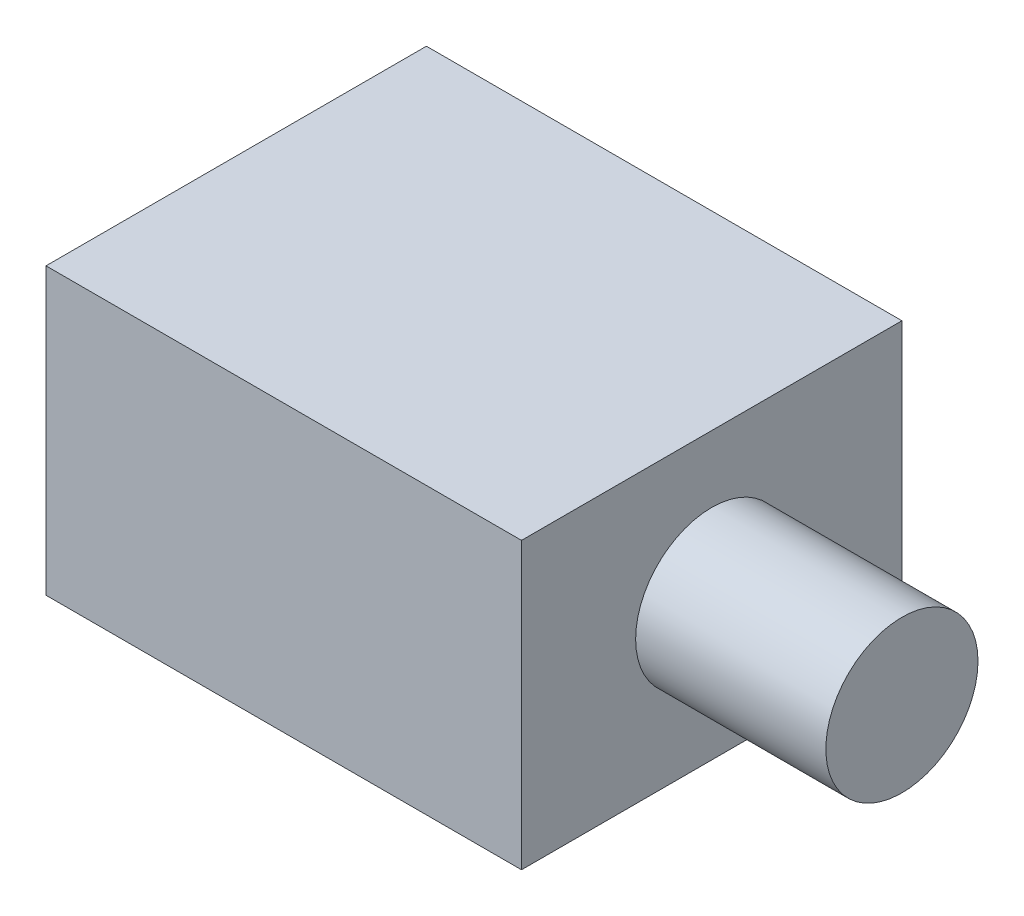
ISO-10303-21;
HEADER;
FILE_DESCRIPTION(('STEP AP214'),'2;1');
FILE_NAME('part.step','',(''),(''),'','','');
FILE_SCHEMA(('AUTOMOTIVE_DESIGN { 1 0 10303 214 1 1 1 1 }'));
ENDSEC;
DATA;
#1=APPLICATION_CONTEXT('core data for automotive mechanical design processes');
#2=APPLICATION_PROTOCOL_DEFINITION('international standard','automotive_design',2000,#1);
#3=PRODUCT_CONTEXT('',#1,'mechanical');
#4=PRODUCT('Part','Part','',(#3));
#5=PRODUCT_RELATED_PRODUCT_CATEGORY('part','',(#4));
#6=PRODUCT_DEFINITION_FORMATION('','',#4);
#7=PRODUCT_DEFINITION_CONTEXT('part definition',#1,'design');
#8=PRODUCT_DEFINITION('design','',#6,#7);
#9=PRODUCT_DEFINITION_SHAPE('','',#8);
#10=(LENGTH_UNIT() NAMED_UNIT(*) SI_UNIT(.MILLI.,.METRE.));
#11=(NAMED_UNIT(*) PLANE_ANGLE_UNIT() SI_UNIT($,.RADIAN.));
#12=(NAMED_UNIT(*) SI_UNIT($,.STERADIAN.) SOLID_ANGLE_UNIT());
#13=UNCERTAINTY_MEASURE_WITH_UNIT(LENGTH_MEASURE(1.E-05),#10,'distance_accuracy_value','');
#14=(GEOMETRIC_REPRESENTATION_CONTEXT(3) GLOBAL_UNCERTAINTY_ASSIGNED_CONTEXT((#13)) GLOBAL_UNIT_ASSIGNED_CONTEXT((#10,
#11,#12)) REPRESENTATION_CONTEXT('',''));
#15=CARTESIAN_POINT('',(0.,0.,0.));
#16=DIRECTION('',(0.,0.,1.));
#17=DIRECTION('',(1.,0.,0.));
#18=AXIS2_PLACEMENT_3D('',#15,#16,#17);
#19=CARTESIAN_POINT('',(-25.,30.,20.));
#20=DIRECTION('',(1.,0.,0.));
#21=DIRECTION('',(0.,0.,-1.));
#22=AXIS2_PLACEMENT_3D('',#19,#20,#21);
#23=PLANE('',#22);
#24=DIRECTION('',(0.,0.,1.));
#25=VECTOR('',#24,1.);
#26=CARTESIAN_POINT('',(-25.,0.,20.));
#27=LINE('',#26,#25);
#28=CARTESIAN_POINT('',(-25.,0.,-20.));
#29=VERTEX_POINT('',#28);
#30=CARTESIAN_POINT('',(-25.,0.,20.));
#31=VERTEX_POINT('',#30);
#32=EDGE_CURVE('E123',#29,#31,#27,.T.);
#33=ORIENTED_EDGE('',*,*,#32,.T.);
#34=DIRECTION('',(0.,-1.,0.));
#35=VECTOR('',#34,1.);
#36=CARTESIAN_POINT('',(-25.,30.,20.));
#37=LINE('',#36,#35);
#38=CARTESIAN_POINT('',(-25.,30.,20.));
#39=VERTEX_POINT('',#38);
#40=EDGE_CURVE('E55',#39,#31,#37,.T.);
#41=ORIENTED_EDGE('',*,*,#40,.F.);
#42=DIRECTION('',(0.,0.,1.));
#43=VECTOR('',#42,1.);
#44=CARTESIAN_POINT('',(-25.,30.,20.));
#45=LINE('',#44,#43);
#46=CARTESIAN_POINT('',(-25.,30.,-20.));
#47=VERTEX_POINT('',#46);
#48=EDGE_CURVE('E106',#47,#39,#45,.T.);
#49=ORIENTED_EDGE('',*,*,#48,.F.);
#50=DIRECTION('',(0.,-1.,0.));
#51=VECTOR('',#50,1.);
#52=CARTESIAN_POINT('',(-25.,30.,-20.));
#53=LINE('',#52,#51);
#54=EDGE_CURVE('E119',#47,#29,#53,.T.);
#55=ORIENTED_EDGE('',*,*,#54,.T.);
#56=EDGE_LOOP('',(#33,#41,#49,#55));
#57=FACE_BOUND('',#56,.T.);
#58=ADVANCED_FACE('F51',(#57),#23,.F.);
#59=CARTESIAN_POINT('',(25.,30.,20.));
#60=DIRECTION('',(0.,0.,-1.));
#61=DIRECTION('',(-1.,0.,0.));
#62=AXIS2_PLACEMENT_3D('',#59,#60,#61);
#63=PLANE('',#62);
#64=DIRECTION('',(1.,0.,0.));
#65=VECTOR('',#64,1.);
#66=CARTESIAN_POINT('',(25.,0.,20.));
#67=LINE('',#66,#65);
#68=CARTESIAN_POINT('',(25.,0.,20.));
#69=VERTEX_POINT('',#68);
#70=EDGE_CURVE('E112',#31,#69,#67,.T.);
#71=ORIENTED_EDGE('',*,*,#70,.T.);
#72=DIRECTION('',(0.,-1.,0.));
#73=VECTOR('',#72,1.);
#74=CARTESIAN_POINT('',(25.,30.,20.));
#75=LINE('',#74,#73);
#76=CARTESIAN_POINT('',(25.,30.,20.));
#77=VERTEX_POINT('',#76);
#78=EDGE_CURVE('E110',#77,#69,#75,.T.);
#79=ORIENTED_EDGE('',*,*,#78,.F.);
#80=DIRECTION('',(1.,0.,0.));
#81=VECTOR('',#80,1.);
#82=CARTESIAN_POINT('',(25.,30.,20.));
#83=LINE('',#82,#81);
#84=EDGE_CURVE('E101',#39,#77,#83,.T.);
#85=ORIENTED_EDGE('',*,*,#84,.F.);
#86=ORIENTED_EDGE('',*,*,#40,.T.);
#87=EDGE_LOOP('',(#71,#79,#85,#86));
#88=FACE_BOUND('',#87,.T.);
#89=ADVANCED_FACE('F111',(#88),#63,.F.);
#90=CARTESIAN_POINT('',(25.,30.,-20.));
#91=DIRECTION('',(-1.,0.,0.));
#92=DIRECTION('',(0.,0.,1.));
#93=AXIS2_PLACEMENT_3D('',#90,#91,#92);
#94=PLANE('',#93);
#95=CARTESIAN_POINT('',(25.,15.,0.));
#96=DIRECTION('',(-1.,0.,0.));
#97=DIRECTION('',(0.,0.,1.));
#98=AXIS2_PLACEMENT_3D('',#95,#96,#97);
#99=CIRCLE('',#98,8.);
#100=CARTESIAN_POINT('',(25.,15.,8.));
#101=VERTEX_POINT('',#100);
#102=EDGE_CURVE('E11',#101,#101,#99,.F.);
#103=ORIENTED_EDGE('',*,*,#102,.F.);
#104=EDGE_LOOP('',(#103));
#105=FACE_BOUND('',#104,.T.);
#106=DIRECTION('',(0.,0.,-1.));
#107=VECTOR('',#106,1.);
#108=CARTESIAN_POINT('',(25.,0.,-20.));
#109=LINE('',#108,#107);
#110=CARTESIAN_POINT('',(25.,0.,-20.));
#111=VERTEX_POINT('',#110);
#112=EDGE_CURVE('E87',#69,#111,#109,.T.);
#113=ORIENTED_EDGE('',*,*,#112,.T.);
#114=DIRECTION('',(0.,-1.,0.));
#115=VECTOR('',#114,1.);
#116=CARTESIAN_POINT('',(25.,30.,-20.));
#117=LINE('',#116,#115);
#118=CARTESIAN_POINT('',(25.,30.,-20.));
#119=VERTEX_POINT('',#118);
#120=EDGE_CURVE('E114',#119,#111,#117,.T.);
#121=ORIENTED_EDGE('',*,*,#120,.F.);
#122=DIRECTION('',(0.,0.,-1.));
#123=VECTOR('',#122,1.);
#124=CARTESIAN_POINT('',(25.,30.,-20.));
#125=LINE('',#124,#123);
#126=EDGE_CURVE('E104',#77,#119,#125,.T.);
#127=ORIENTED_EDGE('',*,*,#126,.F.);
#128=ORIENTED_EDGE('',*,*,#78,.T.);
#129=EDGE_LOOP('',(#113,#121,#127,#128));
#130=FACE_BOUND('',#129,.T.);
#131=ADVANCED_FACE('F115',(#105,#130),#94,.F.);
#132=CARTESIAN_POINT('',(-25.,30.,-20.));
#133=DIRECTION('',(0.,0.,1.));
#134=DIRECTION('',(1.,0.,0.));
#135=AXIS2_PLACEMENT_3D('',#132,#133,#134);
#136=PLANE('',#135);
#137=DIRECTION('',(-1.,0.,0.));
#138=VECTOR('',#137,1.);
#139=CARTESIAN_POINT('',(-25.,0.,-20.));
#140=LINE('',#139,#138);
#141=EDGE_CURVE('E93',#111,#29,#140,.T.);
#142=ORIENTED_EDGE('',*,*,#141,.T.);
#143=ORIENTED_EDGE('',*,*,#54,.F.);
#144=DIRECTION('',(-1.,0.,0.));
#145=VECTOR('',#144,1.);
#146=CARTESIAN_POINT('',(-25.,30.,-20.));
#147=LINE('',#146,#145);
#148=EDGE_CURVE('E70',#119,#47,#147,.T.);
#149=ORIENTED_EDGE('',*,*,#148,.F.);
#150=ORIENTED_EDGE('',*,*,#120,.T.);
#151=EDGE_LOOP('',(#142,#143,#149,#150));
#152=FACE_BOUND('',#151,.T.);
#153=ADVANCED_FACE('F138',(#152),#136,.F.);
#154=CARTESIAN_POINT('',(0.,30.,0.));
#155=DIRECTION('',(0.,-1.,0.));
#156=DIRECTION('',(0.,0.,-1.));
#157=AXIS2_PLACEMENT_3D('',#154,#155,#156);
#158=PLANE('',#157);
#159=ORIENTED_EDGE('',*,*,#48,.T.);
#160=ORIENTED_EDGE('',*,*,#84,.T.);
#161=ORIENTED_EDGE('',*,*,#126,.T.);
#162=ORIENTED_EDGE('',*,*,#148,.T.);
#163=EDGE_LOOP('',(#159,#160,#161,#162));
#164=FACE_BOUND('',#163,.T.);
#165=ADVANCED_FACE('F102',(#164),#158,.F.);
#166=CARTESIAN_POINT('',(0.,0.,0.));
#167=DIRECTION('',(0.,-1.,0.));
#168=DIRECTION('',(0.,0.,-1.));
#169=AXIS2_PLACEMENT_3D('',#166,#167,#168);
#170=PLANE('',#169);
#171=ORIENTED_EDGE('',*,*,#32,.F.);
#172=ORIENTED_EDGE('',*,*,#141,.F.);
#173=ORIENTED_EDGE('',*,*,#112,.F.);
#174=ORIENTED_EDGE('',*,*,#70,.F.);
#175=EDGE_LOOP('',(#171,#172,#173,#174));
#176=FACE_BOUND('',#175,.T.);
#177=ADVANCED_FACE('F141',(#176),#170,.T.);
#178=CARTESIAN_POINT('',(45.,15.,0.));
#179=DIRECTION('',(1.,0.,0.));
#180=DIRECTION('',(0.,0.,-1.));
#181=AXIS2_PLACEMENT_3D('',#178,#179,#180);
#182=PLANE('',#181);
#183=CARTESIAN_POINT('',(45.,15.,0.));
#184=DIRECTION('',(1.,0.,0.));
#185=DIRECTION('',(0.,0.,-1.));
#186=AXIS2_PLACEMENT_3D('',#183,#184,#185);
#187=CIRCLE('',#186,8.);
#188=CARTESIAN_POINT('',(45.,15.,-8.));
#189=VERTEX_POINT('',#188);
#190=EDGE_CURVE('E127',#189,#189,#187,.T.);
#191=ORIENTED_EDGE('',*,*,#190,.T.);
#192=EDGE_LOOP('',(#191));
#193=FACE_BOUND('',#192,.T.);
#194=ADVANCED_FACE('F149',(#193),#182,.T.);
#195=CARTESIAN_POINT('',(-25.002,15.,0.));
#196=DIRECTION('',(1.,0.,0.));
#197=DIRECTION('',(0.,0.,-1.));
#198=AXIS2_PLACEMENT_3D('',#195,#196,#197);
#199=CYLINDRICAL_SURFACE('',#198,8.);
#200=ORIENTED_EDGE('',*,*,#190,.F.);
#201=EDGE_LOOP('',(#200));
#202=FACE_BOUND('',#201,.T.);
#203=ORIENTED_EDGE('',*,*,#102,.T.);
#204=EDGE_LOOP('',(#203));
#205=FACE_BOUND('',#204,.T.);
#206=ADVANCED_FACE('F151',(#202,#205),#199,.T.);
#207=CLOSED_SHELL('',(#58,#89,#131,#153,#165,#177,#194,#206));
#208=MANIFOLD_SOLID_BREP('B2',#207);
#209=ADVANCED_BREP_SHAPE_REPRESENTATION('',(#18,#208),#14);
#210=SHAPE_DEFINITION_REPRESENTATION(#9,#209);
ENDSEC;
END-ISO-10303-21;
